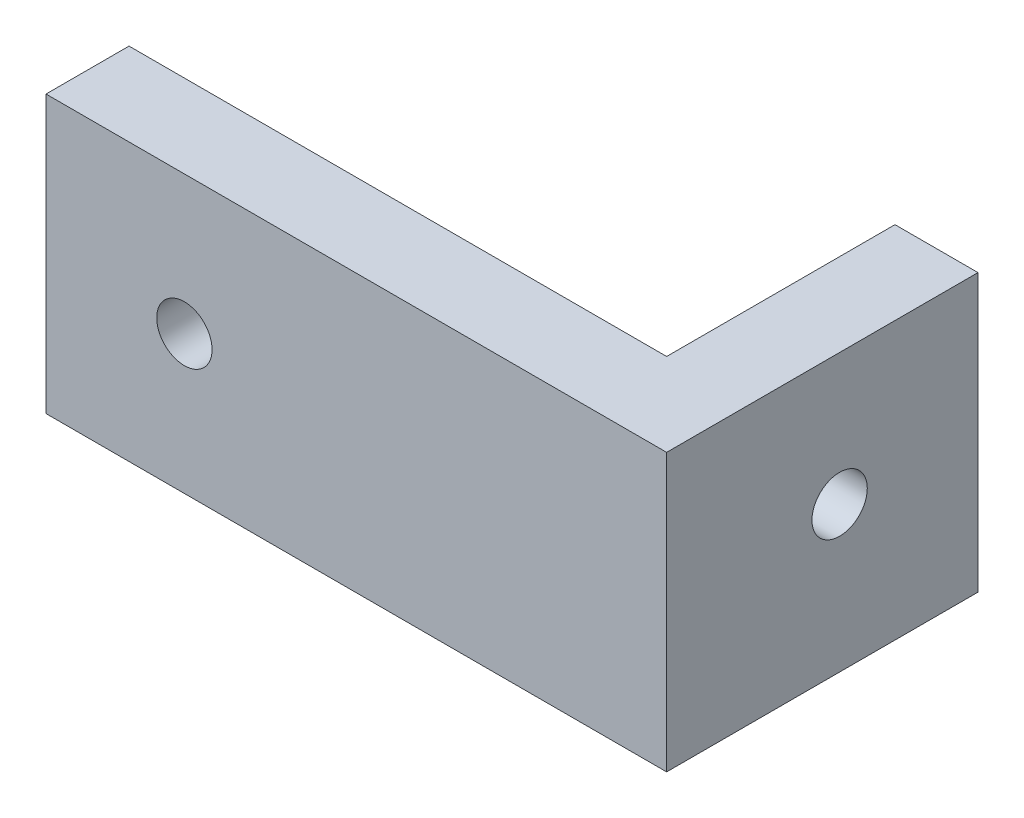
ISO-10303-21;
HEADER;
FILE_DESCRIPTION(('STEP AP214'),'2;1');
FILE_NAME('part.step','',(''),(''),'','','');
FILE_SCHEMA(('AUTOMOTIVE_DESIGN { 1 0 10303 214 1 1 1 1 }'));
ENDSEC;
DATA;
#1=APPLICATION_CONTEXT('core data for automotive mechanical design processes');
#2=APPLICATION_PROTOCOL_DEFINITION('international standard','automotive_design',2000,#1);
#3=PRODUCT_CONTEXT('',#1,'mechanical');
#4=PRODUCT('Part','Part','',(#3));
#5=PRODUCT_RELATED_PRODUCT_CATEGORY('part','',(#4));
#6=PRODUCT_DEFINITION_FORMATION('','',#4);
#7=PRODUCT_DEFINITION_CONTEXT('part definition',#1,'design');
#8=PRODUCT_DEFINITION('design','',#6,#7);
#9=PRODUCT_DEFINITION_SHAPE('','',#8);
#10=(LENGTH_UNIT() NAMED_UNIT(*) SI_UNIT(.MILLI.,.METRE.));
#11=(NAMED_UNIT(*) PLANE_ANGLE_UNIT() SI_UNIT($,.RADIAN.));
#12=(NAMED_UNIT(*) SI_UNIT($,.STERADIAN.) SOLID_ANGLE_UNIT());
#13=UNCERTAINTY_MEASURE_WITH_UNIT(LENGTH_MEASURE(1.E-05),#10,'distance_accuracy_value','');
#14=(GEOMETRIC_REPRESENTATION_CONTEXT(3) GLOBAL_UNCERTAINTY_ASSIGNED_CONTEXT((#13)) GLOBAL_UNIT_ASSIGNED_CONTEXT((#10,
#11,#12)) REPRESENTATION_CONTEXT('',''));
#15=CARTESIAN_POINT('',(0.,0.,0.));
#16=DIRECTION('',(0.,0.,1.));
#17=DIRECTION('',(1.,0.,0.));
#18=AXIS2_PLACEMENT_3D('',#15,#16,#17);
#19=CARTESIAN_POINT('',(166.699999999995,0.,0.));
#20=DIRECTION('',(-1.,0.,0.));
#21=DIRECTION('',(0.,0.,-1.));
#22=AXIS2_PLACEMENT_3D('',#19,#20,#21);
#23=PLANE('',#22);
#24=CARTESIAN_POINT('',(166.699999999995,2.99999999999889,-12.5000000000006));
#25=DIRECTION('',(1.,0.,0.));
#26=DIRECTION('',(0.,0.,-1.));
#27=AXIS2_PLACEMENT_3D('',#24,#25,#26);
#28=CIRCLE('',#27,2.);
#29=CARTESIAN_POINT('',(166.699999999995,2.99999999999889,-14.5000000000006));
#30=VERTEX_POINT('',#29);
#31=EDGE_CURVE('E232',#30,#30,#28,.T.);
#32=ORIENTED_EDGE('',*,*,#31,.T.);
#33=EDGE_LOOP('',(#32));
#34=FACE_BOUND('',#33,.T.);
#35=DIRECTION('',(0.,1.,0.));
#36=VECTOR('',#35,1.);
#37=CARTESIAN_POINT('',(166.699999999995,0.,-9.10000000000063));
#38=LINE('',#37,#36);
#39=CARTESIAN_POINT('',(166.699999999995,1.03700908475416,-9.10000000000063));
#40=VERTEX_POINT('',#39);
#41=CARTESIAN_POINT('',(166.699999999995,4.96299091524362,-9.10000000000063));
#42=VERTEX_POINT('',#41);
#43=EDGE_CURVE('E171',#40,#42,#38,.T.);
#44=ORIENTED_EDGE('',*,*,#43,.T.);
#45=DIRECTION('',(0.,0.5,-0.866025403784439));
#46=VECTOR('',#45,1.);
#47=CARTESIAN_POINT('',(166.699999999995,-0.218172400786755,-0.125961894323983));
#48=LINE('',#47,#46);
#49=CARTESIAN_POINT('',(166.699999999995,6.92598183048834,-12.5000000000006));
#50=VERTEX_POINT('',#49);
#51=EDGE_CURVE('E208',#42,#50,#48,.T.);
#52=ORIENTED_EDGE('',*,*,#51,.T.);
#53=DIRECTION('',(0.,-0.5,-0.866025403784439));
#54=VECTOR('',#53,1.);
#55=CARTESIAN_POINT('',(166.699999999995,10.6071451465193,-6.12403810567634));
#56=LINE('',#55,#54);
#57=CARTESIAN_POINT('',(166.699999999995,4.96299091524361,-15.9000000000006));
#58=VERTEX_POINT('',#57);
#59=EDGE_CURVE('E211',#50,#58,#56,.T.);
#60=ORIENTED_EDGE('',*,*,#59,.T.);
#61=DIRECTION('',(0.,-1.,0.));
#62=VECTOR('',#61,1.);
#63=CARTESIAN_POINT('',(166.699999999995,0.,-15.9000000000006));
#64=LINE('',#63,#62);
#65=CARTESIAN_POINT('',(166.699999999995,1.03700908475417,-15.9000000000006));
#66=VERTEX_POINT('',#65);
#67=EDGE_CURVE('E194',#58,#66,#64,.T.);
#68=ORIENTED_EDGE('',*,*,#67,.T.);
#69=DIRECTION('',(0.,-0.5,0.866025403784439));
#70=VECTOR('',#69,1.);
#71=CARTESIAN_POINT('',(166.699999999995,-6.10714514652094,-3.52596189432399));
#72=LINE('',#71,#70);
#73=CARTESIAN_POINT('',(166.699999999995,-0.925981830490563,-12.5000000000006));
#74=VERTEX_POINT('',#73);
#75=EDGE_CURVE('E191',#66,#74,#72,.T.);
#76=ORIENTED_EDGE('',*,*,#75,.T.);
#77=DIRECTION('',(0.,0.5,0.866025403784439));
#78=VECTOR('',#77,1.);
#79=CARTESIAN_POINT('',(166.699999999995,4.71817240078509,-2.72403810567633));
#80=LINE('',#79,#78);
#81=EDGE_CURVE('E205',#74,#40,#80,.T.);
#82=ORIENTED_EDGE('',*,*,#81,.T.);
#83=EDGE_LOOP('',(#44,#52,#60,#68,#76,#82));
#84=FACE_BOUND('',#83,.T.);
#85=ADVANCED_FACE('F37',(#34,#84),#23,.T.);
#86=CARTESIAN_POINT('',(0.,0.,-6.));
#87=DIRECTION('',(0.,0.,-1.));
#88=DIRECTION('',(1.,0.,0.));
#89=AXIS2_PLACEMENT_3D('',#86,#87,#88);
#90=PLANE('',#89);
#91=DIRECTION('',(0.,-1.,0.));
#92=VECTOR('',#91,1.);
#93=CARTESIAN_POINT('',(163.699999999995,0.,-6.));
#94=LINE('',#93,#92);
#95=CARTESIAN_POINT('',(163.699999999995,12.5000000000001,-6.));
#96=VERTEX_POINT('',#95);
#97=CARTESIAN_POINT('',(163.699999999995,-7.49999999999993,-6.));
#98=VERTEX_POINT('',#97);
#99=EDGE_CURVE('E225',#96,#98,#94,.T.);
#100=ORIENTED_EDGE('',*,*,#99,.T.);
#101=DIRECTION('',(1.,0.,0.));
#102=VECTOR('',#101,1.);
#103=CARTESIAN_POINT('',(0.,-7.49999999999996,-6.));
#104=LINE('',#103,#102);
#105=CARTESIAN_POINT('',(124.850000000005,-7.49999999999993,-6.));
#106=VERTEX_POINT('',#105);
#107=EDGE_CURVE('E284',#106,#98,#104,.T.);
#108=ORIENTED_EDGE('',*,*,#107,.F.);
#109=DIRECTION('',(0.,-1.,0.));
#110=VECTOR('',#109,1.);
#111=CARTESIAN_POINT('',(124.850000000005,0.,-6.));
#112=LINE('',#111,#110);
#113=CARTESIAN_POINT('',(124.850000000005,12.5000000000001,-6.));
#114=VERTEX_POINT('',#113);
#115=EDGE_CURVE('E295',#114,#106,#112,.T.);
#116=ORIENTED_EDGE('',*,*,#115,.F.);
#117=DIRECTION('',(1.,0.,0.));
#118=VECTOR('',#117,1.);
#119=CARTESIAN_POINT('',(0.,12.5,-6.));
#120=LINE('',#119,#118);
#121=EDGE_CURVE('E298',#114,#96,#120,.T.);
#122=ORIENTED_EDGE('',*,*,#121,.T.);
#123=EDGE_LOOP('',(#100,#108,#116,#122));
#124=FACE_BOUND('',#123,.T.);
#125=DIRECTION('',(0.499999999999999,0.866025403784439,0.));
#126=VECTOR('',#125,1.);
#127=CARTESIAN_POINT('',(97.1104818724058,-56.0667628501677,-6.));
#128=LINE('',#127,#126);
#129=CARTESIAN_POINT('',(130.924018169515,2.50000000000006,-6.));
#130=VERTEX_POINT('',#129);
#131=CARTESIAN_POINT('',(132.88700908476,5.90000000000007,-6.));
#132=VERTEX_POINT('',#131);
#133=EDGE_CURVE('E246',#130,#132,#128,.T.);
#134=ORIENTED_EDGE('',*,*,#133,.F.);
#135=DIRECTION('',(-0.499999999999994,0.866025403784442,0.));
#136=VECTOR('',#135,1.);
#137=CARTESIAN_POINT('',(99.2755453818676,57.3167628501673,-6.));
#138=LINE('',#137,#136);
#139=CARTESIAN_POINT('',(132.88700908476,-0.899999999999929,-6.));
#140=VERTEX_POINT('',#139);
#141=EDGE_CURVE('E262',#140,#130,#138,.T.);
#142=ORIENTED_EDGE('',*,*,#141,.F.);
#143=DIRECTION('',(-1.,0.,0.));
#144=VECTOR('',#143,1.);
#145=CARTESIAN_POINT('',(0.,-0.899999999999915,-6.));
#146=LINE('',#145,#144);
#147=CARTESIAN_POINT('',(136.812990915249,-0.89999999999993,-6.));
#148=VERTEX_POINT('',#147);
#149=EDGE_CURVE('E259',#148,#140,#146,.T.);
#150=ORIENTED_EDGE('',*,*,#149,.F.);
#151=DIRECTION('',(-0.500000000000003,-0.866025403784437,0.));
#152=VECTOR('',#151,1.);
#153=CARTESIAN_POINT('',(102.999454618139,-59.466762850168,-6.));
#154=LINE('',#153,#152);
#155=CARTESIAN_POINT('',(138.775981830494,2.50000000000005,-6.));
#156=VERTEX_POINT('',#155);
#157=EDGE_CURVE('E256',#156,#148,#154,.T.);
#158=ORIENTED_EDGE('',*,*,#157,.F.);
#159=DIRECTION('',(0.500000000000001,-0.866025403784438,0.));
#160=VECTOR('',#159,1.);
#161=CARTESIAN_POINT('',(105.164518127601,60.7167628501678,-6.));
#162=LINE('',#161,#160);
#163=CARTESIAN_POINT('',(136.812990915249,5.90000000000007,-6.));
#164=VERTEX_POINT('',#163);
#165=EDGE_CURVE('E253',#164,#156,#162,.T.);
#166=ORIENTED_EDGE('',*,*,#165,.F.);
#167=DIRECTION('',(1.,0.,0.));
#168=VECTOR('',#167,1.);
#169=CARTESIAN_POINT('',(0.,5.90000000000007,-6.));
#170=LINE('',#169,#168);
#171=EDGE_CURVE('E249',#132,#164,#170,.T.);
#172=ORIENTED_EDGE('',*,*,#171,.F.);
#173=EDGE_LOOP('',(#134,#142,#150,#158,#166,#172));
#174=FACE_BOUND('',#173,.T.);
#175=ADVANCED_FACE('F336',(#124,#174),#90,.T.);
#176=CARTESIAN_POINT('',(124.850000000005,0.,-3.));
#177=DIRECTION('',(-1.,0.,0.));
#178=DIRECTION('',(0.,0.,-1.));
#179=AXIS2_PLACEMENT_3D('',#176,#177,#178);
#180=PLANE('',#179);
#181=DIRECTION('',(0.,1.,0.));
#182=VECTOR('',#181,1.);
#183=CARTESIAN_POINT('',(124.850000000005,0.,0.));
#184=LINE('',#183,#182);
#185=CARTESIAN_POINT('',(124.850000000005,-7.49999999999993,0.));
#186=VERTEX_POINT('',#185);
#187=CARTESIAN_POINT('',(124.850000000005,12.5000000000001,0.));
#188=VERTEX_POINT('',#187);
#189=EDGE_CURVE('E300',#186,#188,#184,.T.);
#190=ORIENTED_EDGE('',*,*,#189,.T.);
#191=DIRECTION('',(0.,0.,1.));
#192=VECTOR('',#191,1.);
#193=CARTESIAN_POINT('',(124.850000000005,12.5000000000001,-3.));
#194=LINE('',#193,#192);
#195=EDGE_CURVE('E304',#114,#188,#194,.T.);
#196=ORIENTED_EDGE('',*,*,#195,.F.);
#197=ORIENTED_EDGE('',*,*,#115,.T.);
#198=DIRECTION('',(0.,0.,1.));
#199=VECTOR('',#198,1.);
#200=CARTESIAN_POINT('',(124.850000000005,-7.49999999999993,-3.));
#201=LINE('',#200,#199);
#202=EDGE_CURVE('E11',#106,#186,#201,.T.);
#203=ORIENTED_EDGE('',*,*,#202,.T.);
#204=EDGE_LOOP('',(#190,#196,#197,#203));
#205=FACE_BOUND('',#204,.T.);
#206=ADVANCED_FACE('F39',(#205),#180,.T.);
#207=CARTESIAN_POINT('',(0.,-7.49999999999996,-3.));
#208=DIRECTION('',(0.,-1.,0.));
#209=DIRECTION('',(1.,0.,0.));
#210=AXIS2_PLACEMENT_3D('',#207,#208,#209);
#211=PLANE('',#210);
#212=DIRECTION('',(-1.,0.,0.));
#213=VECTOR('',#212,1.);
#214=CARTESIAN_POINT('',(0.,-7.49999999999996,0.));
#215=LINE('',#214,#213);
#216=CARTESIAN_POINT('',(169.699999999995,-7.49999999999992,0.));
#217=VERTEX_POINT('',#216);
#218=EDGE_CURVE('E308',#217,#186,#215,.T.);
#219=ORIENTED_EDGE('',*,*,#218,.T.);
#220=ORIENTED_EDGE('',*,*,#202,.F.);
#221=ORIENTED_EDGE('',*,*,#107,.T.);
#222=DIRECTION('',(0.,0.,1.));
#223=VECTOR('',#222,1.);
#224=CARTESIAN_POINT('',(163.699999999995,-7.49999999999991,0.));
#225=LINE('',#224,#223);
#226=CARTESIAN_POINT('',(163.699999999995,-7.49999999999991,-22.5000000000006));
#227=VERTEX_POINT('',#226);
#228=EDGE_CURVE('E52',#227,#98,#225,.T.);
#229=ORIENTED_EDGE('',*,*,#228,.F.);
#230=DIRECTION('',(1.,0.,0.));
#231=VECTOR('',#230,1.);
#232=CARTESIAN_POINT('',(166.699999999995,-7.49999999999991,-22.5000000000006));
#233=LINE('',#232,#231);
#234=CARTESIAN_POINT('',(169.699999999995,-7.49999999999991,-22.5000000000006));
#235=VERTEX_POINT('',#234);
#236=EDGE_CURVE('E242',#227,#235,#233,.T.);
#237=ORIENTED_EDGE('',*,*,#236,.T.);
#238=DIRECTION('',(0.,0.,1.));
#239=VECTOR('',#238,1.);
#240=CARTESIAN_POINT('',(169.699999999995,-7.49999999999992,-3.));
#241=LINE('',#240,#239);
#242=EDGE_CURVE('E45',#235,#217,#241,.T.);
#243=ORIENTED_EDGE('',*,*,#242,.T.);
#244=EDGE_LOOP('',(#219,#220,#221,#229,#237,#243));
#245=FACE_BOUND('',#244,.T.);
#246=ADVANCED_FACE('F325',(#245),#211,.T.);
#247=CARTESIAN_POINT('',(169.699999999995,0.,-3.));
#248=DIRECTION('',(-1.,0.,0.));
#249=DIRECTION('',(0.,0.,-1.));
#250=AXIS2_PLACEMENT_3D('',#247,#248,#249);
#251=PLANE('',#250);
#252=DIRECTION('',(0.,1.,0.));
#253=VECTOR('',#252,1.);
#254=CARTESIAN_POINT('',(169.699999999995,0.,0.));
#255=LINE('',#254,#253);
#256=CARTESIAN_POINT('',(169.699999999995,12.5000000000001,0.));
#257=VERTEX_POINT('',#256);
#258=EDGE_CURVE('E310',#217,#257,#255,.T.);
#259=ORIENTED_EDGE('',*,*,#258,.F.);
#260=ORIENTED_EDGE('',*,*,#242,.F.);
#261=DIRECTION('',(0.,1.,0.));
#262=VECTOR('',#261,1.);
#263=CARTESIAN_POINT('',(169.699999999995,0.,-22.5000000000006));
#264=LINE('',#263,#262);
#265=CARTESIAN_POINT('',(169.699999999995,12.5000000000001,-22.5000000000006));
#266=VERTEX_POINT('',#265);
#267=EDGE_CURVE('E231',#235,#266,#264,.T.);
#268=ORIENTED_EDGE('',*,*,#267,.T.);
#269=DIRECTION('',(0.,0.,1.));
#270=VECTOR('',#269,1.);
#271=CARTESIAN_POINT('',(169.699999999995,12.5000000000001,-3.));
#272=LINE('',#271,#270);
#273=EDGE_CURVE('E319',#266,#257,#272,.T.);
#274=ORIENTED_EDGE('',*,*,#273,.T.);
#275=EDGE_LOOP('',(#259,#260,#268,#274));
#276=FACE_BOUND('',#275,.T.);
#277=CARTESIAN_POINT('',(169.699999999995,2.99999999999889,-12.5000000000006));
#278=DIRECTION('',(1.,0.,0.));
#279=DIRECTION('',(0.,0.,-1.));
#280=AXIS2_PLACEMENT_3D('',#277,#278,#279);
#281=CIRCLE('',#280,2.);
#282=CARTESIAN_POINT('',(169.699999999995,2.99999999999889,-14.5000000000006));
#283=VERTEX_POINT('',#282);
#284=EDGE_CURVE('E236',#283,#283,#281,.T.);
#285=ORIENTED_EDGE('',*,*,#284,.F.);
#286=EDGE_LOOP('',(#285));
#287=FACE_BOUND('',#286,.T.);
#288=ADVANCED_FACE('F342',(#276,#287),#251,.F.);
#289=CARTESIAN_POINT('',(0.,12.5,-3.));
#290=DIRECTION('',(0.,-1.,0.));
#291=DIRECTION('',(1.,0.,0.));
#292=AXIS2_PLACEMENT_3D('',#289,#290,#291);
#293=PLANE('',#292);
#294=DIRECTION('',(-1.,0.,0.));
#295=VECTOR('',#294,1.);
#296=CARTESIAN_POINT('',(0.,12.5,0.));
#297=LINE('',#296,#295);
#298=EDGE_CURVE('E313',#257,#188,#297,.T.);
#299=ORIENTED_EDGE('',*,*,#298,.F.);
#300=ORIENTED_EDGE('',*,*,#273,.F.);
#301=DIRECTION('',(1.,0.,0.));
#302=VECTOR('',#301,1.);
#303=CARTESIAN_POINT('',(166.699999999995,12.5000000000001,-22.5000000000006));
#304=LINE('',#303,#302);
#305=CARTESIAN_POINT('',(163.699999999995,12.5000000000001,-22.5000000000006));
#306=VERTEX_POINT('',#305);
#307=EDGE_CURVE('E235',#306,#266,#304,.T.);
#308=ORIENTED_EDGE('',*,*,#307,.F.);
#309=DIRECTION('',(0.,0.,1.));
#310=VECTOR('',#309,1.);
#311=CARTESIAN_POINT('',(163.699999999995,12.5000000000001,0.));
#312=LINE('',#311,#310);
#313=EDGE_CURVE('E60',#306,#96,#312,.T.);
#314=ORIENTED_EDGE('',*,*,#313,.T.);
#315=ORIENTED_EDGE('',*,*,#121,.F.);
#316=ORIENTED_EDGE('',*,*,#195,.T.);
#317=EDGE_LOOP('',(#299,#300,#308,#314,#315,#316));
#318=FACE_BOUND('',#317,.T.);
#319=ADVANCED_FACE('F339',(#318),#293,.F.);
#320=CARTESIAN_POINT('',(134.850000000005,2.50000000000007,-3.));
#321=DIRECTION('',(0.,0.,1.));
#322=DIRECTION('',(-1.,0.,0.));
#323=AXIS2_PLACEMENT_3D('',#320,#321,#322);
#324=CYLINDRICAL_SURFACE('',#323,2.);
#325=CARTESIAN_POINT('',(134.850000000005,2.50000000000007,-3.));
#326=DIRECTION('',(0.,0.,1.));
#327=DIRECTION('',(1.,0.,0.));
#328=AXIS2_PLACEMENT_3D('',#325,#326,#327);
#329=CIRCLE('',#328,2.);
#330=CARTESIAN_POINT('',(136.850000000005,2.50000000000007,-3.));
#331=VERTEX_POINT('',#330);
#332=EDGE_CURVE('E301',#331,#331,#329,.T.);
#333=ORIENTED_EDGE('',*,*,#332,.F.);
#334=EDGE_LOOP('',(#333));
#335=FACE_BOUND('',#334,.T.);
#336=CARTESIAN_POINT('',(134.850000000005,2.50000000000007,0.));
#337=DIRECTION('',(0.,0.,1.));
#338=DIRECTION('',(1.,0.,0.));
#339=AXIS2_PLACEMENT_3D('',#336,#337,#338);
#340=CIRCLE('',#339,2.);
#341=CARTESIAN_POINT('',(136.850000000005,2.50000000000007,0.));
#342=VERTEX_POINT('',#341);
#343=EDGE_CURVE('E305',#342,#342,#340,.T.);
#344=ORIENTED_EDGE('',*,*,#343,.T.);
#345=EDGE_LOOP('',(#344));
#346=FACE_BOUND('',#345,.T.);
#347=ADVANCED_FACE('F521',(#335,#346),#324,.F.);
#348=CARTESIAN_POINT('',(0.,0.,-3.));
#349=DIRECTION('',(0.,0.,-1.));
#350=DIRECTION('',(1.,0.,0.));
#351=AXIS2_PLACEMENT_3D('',#348,#349,#350);
#352=PLANE('',#351);
#353=DIRECTION('',(1.,0.,0.));
#354=VECTOR('',#353,1.);
#355=CARTESIAN_POINT('',(0.,5.90000000000007,-3.));
#356=LINE('',#355,#354);
#357=CARTESIAN_POINT('',(132.88700908476,5.90000000000007,-3.));
#358=VERTEX_POINT('',#357);
#359=CARTESIAN_POINT('',(136.812990915249,5.90000000000004,-3.));
#360=VERTEX_POINT('',#359);
#361=EDGE_CURVE('E268',#358,#360,#356,.T.);
#362=ORIENTED_EDGE('',*,*,#361,.T.);
#363=DIRECTION('',(0.500000000000001,-0.866025403784438,0.));
#364=VECTOR('',#363,1.);
#365=CARTESIAN_POINT('',(105.164518127601,60.7167628501678,-3.));
#366=LINE('',#365,#364);
#367=CARTESIAN_POINT('',(138.775981830494,2.50000000000005,-3.));
#368=VERTEX_POINT('',#367);
#369=EDGE_CURVE('E271',#360,#368,#366,.T.);
#370=ORIENTED_EDGE('',*,*,#369,.T.);
#371=DIRECTION('',(-0.500000000000003,-0.866025403784437,0.));
#372=VECTOR('',#371,1.);
#373=CARTESIAN_POINT('',(102.999454618139,-59.466762850168,-3.));
#374=LINE('',#373,#372);
#375=CARTESIAN_POINT('',(136.812990915249,-0.89999999999993,-3.));
#376=VERTEX_POINT('',#375);
#377=EDGE_CURVE('E274',#368,#376,#374,.T.);
#378=ORIENTED_EDGE('',*,*,#377,.T.);
#379=DIRECTION('',(-1.,0.,0.));
#380=VECTOR('',#379,1.);
#381=CARTESIAN_POINT('',(0.,-0.899999999999915,-3.));
#382=LINE('',#381,#380);
#383=CARTESIAN_POINT('',(132.88700908476,-0.899999999999929,-3.));
#384=VERTEX_POINT('',#383);
#385=EDGE_CURVE('E277',#376,#384,#382,.T.);
#386=ORIENTED_EDGE('',*,*,#385,.T.);
#387=DIRECTION('',(-0.499999999999994,0.866025403784442,0.));
#388=VECTOR('',#387,1.);
#389=CARTESIAN_POINT('',(99.2755453818676,57.3167628501673,-3.));
#390=LINE('',#389,#388);
#391=CARTESIAN_POINT('',(130.924018169515,2.50000000000006,-3.));
#392=VERTEX_POINT('',#391);
#393=EDGE_CURVE('E250',#384,#392,#390,.T.);
#394=ORIENTED_EDGE('',*,*,#393,.T.);
#395=DIRECTION('',(0.499999999999999,0.866025403784439,0.));
#396=VECTOR('',#395,1.);
#397=CARTESIAN_POINT('',(97.1104818724058,-56.0667628501677,-3.));
#398=LINE('',#397,#396);
#399=EDGE_CURVE('E245',#392,#358,#398,.T.);
#400=ORIENTED_EDGE('',*,*,#399,.T.);
#401=EDGE_LOOP('',(#362,#370,#378,#386,#394,#400));
#402=FACE_BOUND('',#401,.T.);
#403=ORIENTED_EDGE('',*,*,#332,.T.);
#404=EDGE_LOOP('',(#403));
#405=FACE_BOUND('',#404,.T.);
#406=ADVANCED_FACE('F511',(#402,#405),#352,.T.);
#407=CARTESIAN_POINT('',(0.,0.,0.));
#408=DIRECTION('',(0.,0.,-1.));
#409=DIRECTION('',(1.,0.,0.));
#410=AXIS2_PLACEMENT_3D('',#407,#408,#409);
#411=PLANE('',#410);
#412=ORIENTED_EDGE('',*,*,#189,.F.);
#413=ORIENTED_EDGE('',*,*,#218,.F.);
#414=ORIENTED_EDGE('',*,*,#258,.T.);
#415=ORIENTED_EDGE('',*,*,#298,.T.);
#416=EDGE_LOOP('',(#412,#413,#414,#415));
#417=FACE_BOUND('',#416,.T.);
#418=ORIENTED_EDGE('',*,*,#343,.F.);
#419=EDGE_LOOP('',(#418));
#420=FACE_BOUND('',#419,.T.);
#421=ADVANCED_FACE('F330',(#417,#420),#411,.F.);
#422=CARTESIAN_POINT('',(97.1104818724058,-56.0667628501677,-6.));
#423=DIRECTION('',(-0.866025403784439,0.499999999999999,0.));
#424=DIRECTION('',(-0.499999999999999,-0.866025403784439,0.));
#425=AXIS2_PLACEMENT_3D('',#422,#423,#424);
#426=PLANE('',#425);
#427=ORIENTED_EDGE('',*,*,#399,.F.);
#428=DIRECTION('',(0.,0.,1.));
#429=VECTOR('',#428,1.);
#430=CARTESIAN_POINT('',(130.924018169515,2.50000000000006,-6.));
#431=LINE('',#430,#429);
#432=EDGE_CURVE('E282',#130,#392,#431,.T.);
#433=ORIENTED_EDGE('',*,*,#432,.F.);
#434=ORIENTED_EDGE('',*,*,#133,.T.);
#435=DIRECTION('',(0.,0.,1.));
#436=VECTOR('',#435,1.);
#437=CARTESIAN_POINT('',(132.88700908476,5.90000000000007,-6.));
#438=LINE('',#437,#436);
#439=EDGE_CURVE('E265',#132,#358,#438,.T.);
#440=ORIENTED_EDGE('',*,*,#439,.T.);
#441=EDGE_LOOP('',(#427,#433,#434,#440));
#442=FACE_BOUND('',#441,.T.);
#443=ADVANCED_FACE('F492',(#442),#426,.F.);
#444=CARTESIAN_POINT('',(99.2755453818676,57.3167628501673,-6.));
#445=DIRECTION('',(-0.866025403784442,-0.499999999999994,0.));
#446=DIRECTION('',(0.499999999999994,-0.866025403784442,0.));
#447=AXIS2_PLACEMENT_3D('',#444,#445,#446);
#448=PLANE('',#447);
#449=ORIENTED_EDGE('',*,*,#393,.F.);
#450=DIRECTION('',(0.,0.,1.));
#451=VECTOR('',#450,1.);
#452=CARTESIAN_POINT('',(132.88700908476,-0.899999999999929,-6.));
#453=LINE('',#452,#451);
#454=EDGE_CURVE('E285',#140,#384,#453,.T.);
#455=ORIENTED_EDGE('',*,*,#454,.F.);
#456=ORIENTED_EDGE('',*,*,#141,.T.);
#457=ORIENTED_EDGE('',*,*,#432,.T.);
#458=EDGE_LOOP('',(#449,#455,#456,#457));
#459=FACE_BOUND('',#458,.T.);
#460=ADVANCED_FACE('F482',(#459),#448,.F.);
#461=CARTESIAN_POINT('',(0.,-0.899999999999915,-6.));
#462=DIRECTION('',(0.,-1.,0.));
#463=DIRECTION('',(1.,0.,0.));
#464=AXIS2_PLACEMENT_3D('',#461,#462,#463);
#465=PLANE('',#464);
#466=ORIENTED_EDGE('',*,*,#385,.F.);
#467=DIRECTION('',(0.,0.,1.));
#468=VECTOR('',#467,1.);
#469=CARTESIAN_POINT('',(136.812990915249,-0.89999999999993,-6.));
#470=LINE('',#469,#468);
#471=EDGE_CURVE('E287',#148,#376,#470,.T.);
#472=ORIENTED_EDGE('',*,*,#471,.F.);
#473=ORIENTED_EDGE('',*,*,#149,.T.);
#474=ORIENTED_EDGE('',*,*,#454,.T.);
#475=EDGE_LOOP('',(#466,#472,#473,#474));
#476=FACE_BOUND('',#475,.T.);
#477=ADVANCED_FACE('F472',(#476),#465,.F.);
#478=CARTESIAN_POINT('',(102.999454618139,-59.466762850168,-6.));
#479=DIRECTION('',(0.866025403784437,-0.500000000000003,0.));
#480=DIRECTION('',(0.500000000000004,0.866025403784437,0.));
#481=AXIS2_PLACEMENT_3D('',#478,#479,#480);
#482=PLANE('',#481);
#483=ORIENTED_EDGE('',*,*,#377,.F.);
#484=DIRECTION('',(0.,0.,1.));
#485=VECTOR('',#484,1.);
#486=CARTESIAN_POINT('',(138.775981830494,2.50000000000005,-6.));
#487=LINE('',#486,#485);
#488=EDGE_CURVE('E289',#156,#368,#487,.T.);
#489=ORIENTED_EDGE('',*,*,#488,.F.);
#490=ORIENTED_EDGE('',*,*,#157,.T.);
#491=ORIENTED_EDGE('',*,*,#471,.T.);
#492=EDGE_LOOP('',(#483,#489,#490,#491));
#493=FACE_BOUND('',#492,.T.);
#494=ADVANCED_FACE('F462',(#493),#482,.F.);
#495=CARTESIAN_POINT('',(105.164518127601,60.7167628501678,-6.));
#496=DIRECTION('',(0.866025403784438,0.500000000000001,0.));
#497=DIRECTION('',(-0.500000000000001,0.866025403784438,0.));
#498=AXIS2_PLACEMENT_3D('',#495,#496,#497);
#499=PLANE('',#498);
#500=ORIENTED_EDGE('',*,*,#369,.F.);
#501=DIRECTION('',(0.,0.,1.));
#502=VECTOR('',#501,1.);
#503=CARTESIAN_POINT('',(136.812990915249,5.90000000000004,-6.));
#504=LINE('',#503,#502);
#505=EDGE_CURVE('E291',#164,#360,#504,.T.);
#506=ORIENTED_EDGE('',*,*,#505,.F.);
#507=ORIENTED_EDGE('',*,*,#165,.T.);
#508=ORIENTED_EDGE('',*,*,#488,.T.);
#509=EDGE_LOOP('',(#500,#506,#507,#508));
#510=FACE_BOUND('',#509,.T.);
#511=ADVANCED_FACE('F452',(#510),#499,.F.);
#512=CARTESIAN_POINT('',(0.,5.90000000000007,-6.));
#513=DIRECTION('',(0.,1.,0.));
#514=DIRECTION('',(0.,0.,-1.));
#515=AXIS2_PLACEMENT_3D('',#512,#513,#514);
#516=PLANE('',#515);
#517=ORIENTED_EDGE('',*,*,#361,.F.);
#518=ORIENTED_EDGE('',*,*,#439,.F.);
#519=ORIENTED_EDGE('',*,*,#171,.T.);
#520=ORIENTED_EDGE('',*,*,#505,.T.);
#521=EDGE_LOOP('',(#517,#518,#519,#520));
#522=FACE_BOUND('',#521,.T.);
#523=ADVANCED_FACE('F357',(#522),#516,.F.);
#524=CARTESIAN_POINT('',(166.699999999995,0.,-22.5000000000006));
#525=DIRECTION('',(0.,0.,1.));
#526=DIRECTION('',(-1.,0.,0.));
#527=AXIS2_PLACEMENT_3D('',#524,#525,#526);
#528=PLANE('',#527);
#529=ORIENTED_EDGE('',*,*,#267,.F.);
#530=ORIENTED_EDGE('',*,*,#236,.F.);
#531=DIRECTION('',(0.,-1.,0.));
#532=VECTOR('',#531,1.);
#533=CARTESIAN_POINT('',(163.699999999995,0.,-22.5000000000006));
#534=LINE('',#533,#532);
#535=EDGE_CURVE('E229',#306,#227,#534,.T.);
#536=ORIENTED_EDGE('',*,*,#535,.F.);
#537=ORIENTED_EDGE('',*,*,#307,.T.);
#538=EDGE_LOOP('',(#529,#530,#536,#537));
#539=FACE_BOUND('',#538,.T.);
#540=ADVANCED_FACE('F341',(#539),#528,.F.);
#541=CARTESIAN_POINT('',(166.699999999995,2.99999999999889,-12.5000000000006));
#542=DIRECTION('',(1.,0.,0.));
#543=DIRECTION('',(0.,1.,0.));
#544=AXIS2_PLACEMENT_3D('',#541,#542,#543);
#545=CYLINDRICAL_SURFACE('',#544,2.);
#546=ORIENTED_EDGE('',*,*,#31,.F.);
#547=EDGE_LOOP('',(#546));
#548=FACE_BOUND('',#547,.T.);
#549=ORIENTED_EDGE('',*,*,#284,.T.);
#550=EDGE_LOOP('',(#549));
#551=FACE_BOUND('',#550,.T.);
#552=ADVANCED_FACE('F348',(#548,#551),#545,.F.);
#553=CARTESIAN_POINT('',(163.699999999995,0.,0.));
#554=DIRECTION('',(-1.,0.,0.));
#555=DIRECTION('',(0.,0.,-1.));
#556=AXIS2_PLACEMENT_3D('',#553,#554,#555);
#557=PLANE('',#556);
#558=DIRECTION('',(0.,0.5,0.866025403784439));
#559=VECTOR('',#558,1.);
#560=CARTESIAN_POINT('',(163.699999999995,4.71817240078509,-2.72403810567634));
#561=LINE('',#560,#559);
#562=CARTESIAN_POINT('',(163.699999999995,-0.925981830490561,-12.5000000000006));
#563=VERTEX_POINT('',#562);
#564=CARTESIAN_POINT('',(163.699999999995,1.03700908475416,-9.10000000000063));
#565=VERTEX_POINT('',#564);
#566=EDGE_CURVE('E183',#563,#565,#561,.T.);
#567=ORIENTED_EDGE('',*,*,#566,.F.);
#568=DIRECTION('',(0.,-0.5,0.866025403784439));
#569=VECTOR('',#568,1.);
#570=CARTESIAN_POINT('',(163.699999999995,-6.10714514652094,-3.52596189432399));
#571=LINE('',#570,#569);
#572=CARTESIAN_POINT('',(163.699999999995,1.03700908475417,-15.9000000000006));
#573=VERTEX_POINT('',#572);
#574=EDGE_CURVE('E177',#573,#563,#571,.T.);
#575=ORIENTED_EDGE('',*,*,#574,.F.);
#576=DIRECTION('',(0.,-1.,0.));
#577=VECTOR('',#576,1.);
#578=CARTESIAN_POINT('',(163.699999999995,0.,-15.9000000000006));
#579=LINE('',#578,#577);
#580=CARTESIAN_POINT('',(163.699999999995,4.96299091524362,-15.9000000000006));
#581=VERTEX_POINT('',#580);
#582=EDGE_CURVE('E201',#581,#573,#579,.T.);
#583=ORIENTED_EDGE('',*,*,#582,.F.);
#584=DIRECTION('',(0.,-0.5,-0.866025403784439));
#585=VECTOR('',#584,1.);
#586=CARTESIAN_POINT('',(163.699999999995,10.6071451465193,-6.12403810567634));
#587=LINE('',#586,#585);
#588=CARTESIAN_POINT('',(163.699999999995,6.92598183048835,-12.5000000000006));
#589=VERTEX_POINT('',#588);
#590=EDGE_CURVE('E198',#589,#581,#587,.T.);
#591=ORIENTED_EDGE('',*,*,#590,.F.);
#592=DIRECTION('',(0.,0.5,-0.866025403784439));
#593=VECTOR('',#592,1.);
#594=CARTESIAN_POINT('',(163.699999999995,-0.218172400786753,-0.125961894323985));
#595=LINE('',#594,#593);
#596=CARTESIAN_POINT('',(163.699999999995,4.96299091524362,-9.10000000000063));
#597=VERTEX_POINT('',#596);
#598=EDGE_CURVE('E186',#597,#589,#595,.T.);
#599=ORIENTED_EDGE('',*,*,#598,.F.);
#600=DIRECTION('',(0.,1.,0.));
#601=VECTOR('',#600,1.);
#602=CARTESIAN_POINT('',(163.699999999995,0.,-9.10000000000063));
#603=LINE('',#602,#601);
#604=EDGE_CURVE('E168',#565,#597,#603,.T.);
#605=ORIENTED_EDGE('',*,*,#604,.F.);
#606=EDGE_LOOP('',(#567,#575,#583,#591,#599,#605));
#607=FACE_BOUND('',#606,.T.);
#608=ORIENTED_EDGE('',*,*,#313,.F.);
#609=ORIENTED_EDGE('',*,*,#535,.T.);
#610=ORIENTED_EDGE('',*,*,#228,.T.);
#611=ORIENTED_EDGE('',*,*,#99,.F.);
#612=EDGE_LOOP('',(#608,#609,#610,#611));
#613=FACE_BOUND('',#612,.T.);
#614=ADVANCED_FACE('F181',(#607,#613),#557,.T.);
#615=CARTESIAN_POINT('',(163.699999999995,4.71817240078509,-2.72403810567634));
#616=DIRECTION('',(0.,-0.866025403784439,0.5));
#617=DIRECTION('',(0.,0.5,0.866025403784439));
#618=AXIS2_PLACEMENT_3D('',#615,#616,#617);
#619=PLANE('',#618);
#620=ORIENTED_EDGE('',*,*,#81,.F.);
#621=DIRECTION('',(1.,0.,0.));
#622=VECTOR('',#621,1.);
#623=CARTESIAN_POINT('',(163.699999999995,-0.925981830490561,-12.5000000000006));
#624=LINE('',#623,#622);
#625=EDGE_CURVE('E189',#563,#74,#624,.T.);
#626=ORIENTED_EDGE('',*,*,#625,.F.);
#627=ORIENTED_EDGE('',*,*,#566,.T.);
#628=DIRECTION('',(1.,0.,0.));
#629=VECTOR('',#628,1.);
#630=CARTESIAN_POINT('',(163.699999999995,1.03700908475416,-9.10000000000063));
#631=LINE('',#630,#629);
#632=EDGE_CURVE('E165',#565,#40,#631,.T.);
#633=ORIENTED_EDGE('',*,*,#632,.T.);
#634=EDGE_LOOP('',(#620,#626,#627,#633));
#635=FACE_BOUND('',#634,.T.);
#636=ADVANCED_FACE('F188',(#635),#619,.F.);
#637=CARTESIAN_POINT('',(163.699999999995,-6.10714514652094,-3.52596189432399));
#638=DIRECTION('',(0.,-0.866025403784439,-0.5));
#639=DIRECTION('',(0.,-0.5,0.866025403784439));
#640=AXIS2_PLACEMENT_3D('',#637,#638,#639);
#641=PLANE('',#640);
#642=ORIENTED_EDGE('',*,*,#75,.F.);
#643=DIRECTION('',(1.,0.,0.));
#644=VECTOR('',#643,1.);
#645=CARTESIAN_POINT('',(163.699999999995,1.03700908475417,-15.9000000000006));
#646=LINE('',#645,#644);
#647=EDGE_CURVE('E217',#573,#66,#646,.T.);
#648=ORIENTED_EDGE('',*,*,#647,.F.);
#649=ORIENTED_EDGE('',*,*,#574,.T.);
#650=ORIENTED_EDGE('',*,*,#625,.T.);
#651=EDGE_LOOP('',(#642,#648,#649,#650));
#652=FACE_BOUND('',#651,.T.);
#653=ADVANCED_FACE('F371',(#652),#641,.F.);
#654=CARTESIAN_POINT('',(163.699999999995,0.,-15.9000000000006));
#655=DIRECTION('',(0.,0.,-1.));
#656=DIRECTION('',(1.,0.,0.));
#657=AXIS2_PLACEMENT_3D('',#654,#655,#656);
#658=PLANE('',#657);
#659=ORIENTED_EDGE('',*,*,#67,.F.);
#660=DIRECTION('',(1.,0.,0.));
#661=VECTOR('',#660,1.);
#662=CARTESIAN_POINT('',(163.699999999995,4.96299091524362,-15.9000000000006));
#663=LINE('',#662,#661);
#664=EDGE_CURVE('E219',#581,#58,#663,.T.);
#665=ORIENTED_EDGE('',*,*,#664,.F.);
#666=ORIENTED_EDGE('',*,*,#582,.T.);
#667=ORIENTED_EDGE('',*,*,#647,.T.);
#668=EDGE_LOOP('',(#659,#665,#666,#667));
#669=FACE_BOUND('',#668,.T.);
#670=ADVANCED_FACE('F381',(#669),#658,.F.);
#671=CARTESIAN_POINT('',(163.699999999995,10.6071451465193,-6.12403810567634));
#672=DIRECTION('',(0.,0.866025403784439,-0.5));
#673=DIRECTION('',(0.,-0.5,-0.866025403784439));
#674=AXIS2_PLACEMENT_3D('',#671,#672,#673);
#675=PLANE('',#674);
#676=ORIENTED_EDGE('',*,*,#59,.F.);
#677=DIRECTION('',(1.,0.,0.));
#678=VECTOR('',#677,1.);
#679=CARTESIAN_POINT('',(163.699999999995,6.92598183048835,-12.5000000000006));
#680=LINE('',#679,#678);
#681=EDGE_CURVE('E221',#589,#50,#680,.T.);
#682=ORIENTED_EDGE('',*,*,#681,.F.);
#683=ORIENTED_EDGE('',*,*,#590,.T.);
#684=ORIENTED_EDGE('',*,*,#664,.T.);
#685=EDGE_LOOP('',(#676,#682,#683,#684));
#686=FACE_BOUND('',#685,.T.);
#687=ADVANCED_FACE('F377',(#686),#675,.F.);
#688=CARTESIAN_POINT('',(163.699999999995,-0.218172400786753,-0.125961894323985));
#689=DIRECTION('',(0.,0.866025403784439,0.5));
#690=DIRECTION('',(0.,0.5,-0.866025403784439));
#691=AXIS2_PLACEMENT_3D('',#688,#689,#690);
#692=PLANE('',#691);
#693=ORIENTED_EDGE('',*,*,#51,.F.);
#694=DIRECTION('',(1.,0.,0.));
#695=VECTOR('',#694,1.);
#696=CARTESIAN_POINT('',(163.699999999995,4.96299091524362,-9.10000000000064));
#697=LINE('',#696,#695);
#698=EDGE_CURVE('E176',#597,#42,#697,.T.);
#699=ORIENTED_EDGE('',*,*,#698,.F.);
#700=ORIENTED_EDGE('',*,*,#598,.T.);
#701=ORIENTED_EDGE('',*,*,#681,.T.);
#702=EDGE_LOOP('',(#693,#699,#700,#701));
#703=FACE_BOUND('',#702,.T.);
#704=ADVANCED_FACE('F374',(#703),#692,.F.);
#705=CARTESIAN_POINT('',(163.699999999995,0.,-9.10000000000063));
#706=DIRECTION('',(0.,0.,1.));
#707=DIRECTION('',(-1.,0.,0.));
#708=AXIS2_PLACEMENT_3D('',#705,#706,#707);
#709=PLANE('',#708);
#710=ORIENTED_EDGE('',*,*,#43,.F.);
#711=ORIENTED_EDGE('',*,*,#632,.F.);
#712=ORIENTED_EDGE('',*,*,#604,.T.);
#713=ORIENTED_EDGE('',*,*,#698,.T.);
#714=EDGE_LOOP('',(#710,#711,#712,#713));
#715=FACE_BOUND('',#714,.T.);
#716=ADVANCED_FACE('F167',(#715),#709,.F.);
#717=CLOSED_SHELL('',(#85,#175,#206,#246,#288,#319,#347,#406,#421,#443,#460,#477,#494,#511,#523,
#540,#552,#614,#636,#653,#670,#687,#704,#716));
#718=MANIFOLD_SOLID_BREP('B2',#717);
#719=ADVANCED_BREP_SHAPE_REPRESENTATION('',(#18,#718),#14);
#720=SHAPE_DEFINITION_REPRESENTATION(#9,#719);
ENDSEC;
END-ISO-10303-21;
